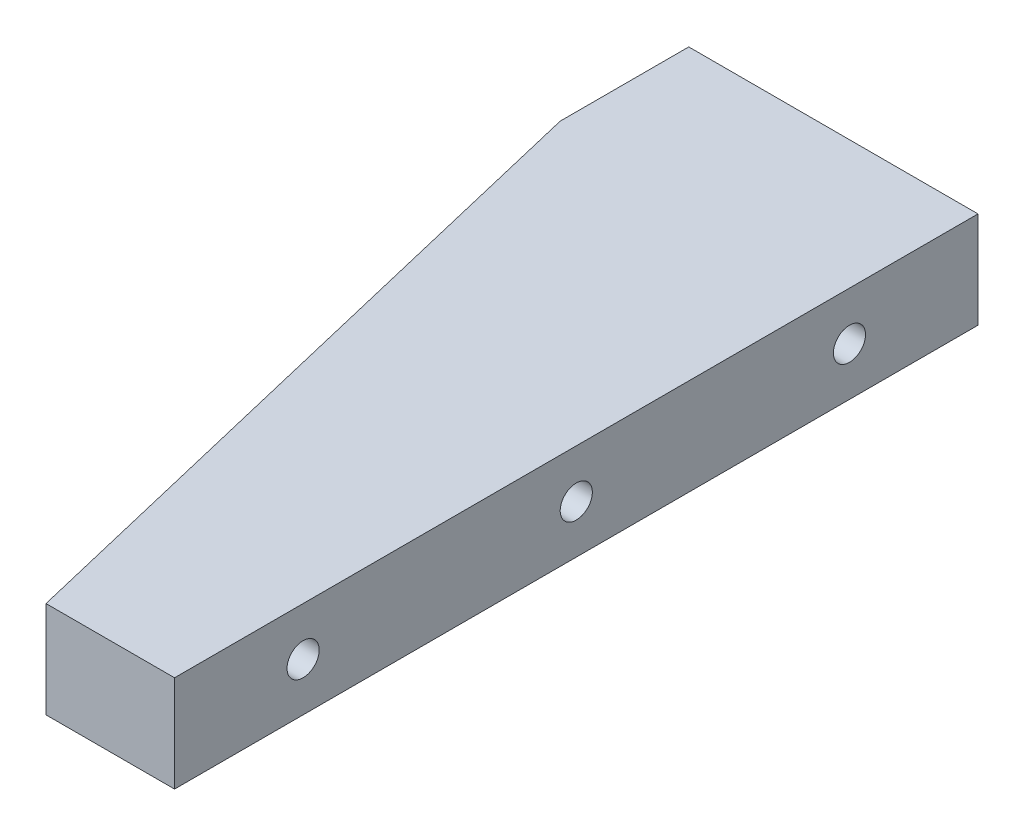
ISO-10303-21;
HEADER;
FILE_DESCRIPTION(('STEP AP214'),'2;1');
FILE_NAME('part.step','',(''),(''),'','','');
FILE_SCHEMA(('AUTOMOTIVE_DESIGN { 1 0 10303 214 1 1 1 1 }'));
ENDSEC;
DATA;
#1=APPLICATION_CONTEXT('core data for automotive mechanical design processes');
#2=APPLICATION_PROTOCOL_DEFINITION('international standard','automotive_design',2000,#1);
#3=PRODUCT_CONTEXT('',#1,'mechanical');
#4=PRODUCT('Part','Part','',(#3));
#5=PRODUCT_RELATED_PRODUCT_CATEGORY('part','',(#4));
#6=PRODUCT_DEFINITION_FORMATION('','',#4);
#7=PRODUCT_DEFINITION_CONTEXT('part definition',#1,'design');
#8=PRODUCT_DEFINITION('design','',#6,#7);
#9=PRODUCT_DEFINITION_SHAPE('','',#8);
#10=(LENGTH_UNIT() NAMED_UNIT(*) SI_UNIT(.MILLI.,.METRE.));
#11=(NAMED_UNIT(*) PLANE_ANGLE_UNIT() SI_UNIT($,.RADIAN.));
#12=(NAMED_UNIT(*) SI_UNIT($,.STERADIAN.) SOLID_ANGLE_UNIT());
#13=UNCERTAINTY_MEASURE_WITH_UNIT(LENGTH_MEASURE(1.E-05),#10,'distance_accuracy_value','');
#14=(GEOMETRIC_REPRESENTATION_CONTEXT(3) GLOBAL_UNCERTAINTY_ASSIGNED_CONTEXT((#13)) GLOBAL_UNIT_ASSIGNED_CONTEXT((#10,
#11,#12)) REPRESENTATION_CONTEXT('',''));
#15=CARTESIAN_POINT('',(0.,0.,0.));
#16=DIRECTION('',(0.,0.,1.));
#17=DIRECTION('',(1.,0.,0.));
#18=AXIS2_PLACEMENT_3D('',#15,#16,#17);
#19=CARTESIAN_POINT('',(-45.,15.,0.));
#20=DIRECTION('',(0.,0.,1.));
#21=DIRECTION('',(1.,0.,0.));
#22=AXIS2_PLACEMENT_3D('',#19,#20,#21);
#23=PLANE('',#22);
#24=CARTESIAN_POINT('',(-35.,7.5,0.));
#25=DIRECTION('',(0.,0.,-1.));
#26=DIRECTION('',(-1.,0.,0.));
#27=AXIS2_PLACEMENT_3D('',#24,#25,#26);
#28=CIRCLE('',#27,2.49999999999999);
#29=CARTESIAN_POINT('',(-37.5,7.5,0.));
#30=VERTEX_POINT('',#29);
#31=EDGE_CURVE('E151',#30,#30,#28,.T.);
#32=ORIENTED_EDGE('',*,*,#31,.F.);
#33=EDGE_LOOP('',(#32));
#34=FACE_BOUND('',#33,.T.);
#35=DIRECTION('',(-1.,0.,0.));
#36=VECTOR('',#35,1.);
#37=CARTESIAN_POINT('',(-45.,0.,0.));
#38=LINE('',#37,#36);
#39=CARTESIAN_POINT('',(0.,0.,0.));
#40=VERTEX_POINT('',#39);
#41=CARTESIAN_POINT('',(-45.,0.,0.));
#42=VERTEX_POINT('',#41);
#43=EDGE_CURVE('E113',#40,#42,#38,.T.);
#44=ORIENTED_EDGE('',*,*,#43,.T.);
#45=DIRECTION('',(0.,-1.,0.));
#46=VECTOR('',#45,1.);
#47=CARTESIAN_POINT('',(-45.,15.,0.));
#48=LINE('',#47,#46);
#49=CARTESIAN_POINT('',(-45.,15.,0.));
#50=VERTEX_POINT('',#49);
#51=EDGE_CURVE('E11',#50,#42,#48,.T.);
#52=ORIENTED_EDGE('',*,*,#51,.F.);
#53=DIRECTION('',(-1.,0.,0.));
#54=VECTOR('',#53,1.);
#55=CARTESIAN_POINT('',(-45.,15.,0.));
#56=LINE('',#55,#54);
#57=CARTESIAN_POINT('',(0.,15.,0.));
#58=VERTEX_POINT('',#57);
#59=EDGE_CURVE('E122',#58,#50,#56,.T.);
#60=ORIENTED_EDGE('',*,*,#59,.F.);
#61=DIRECTION('',(0.,-1.,0.));
#62=VECTOR('',#61,1.);
#63=CARTESIAN_POINT('',(0.,15.,0.));
#64=LINE('',#63,#62);
#65=EDGE_CURVE('E109',#58,#40,#64,.T.);
#66=ORIENTED_EDGE('',*,*,#65,.T.);
#67=EDGE_LOOP('',(#44,#52,#60,#66));
#68=FACE_BOUND('',#67,.T.);
#69=ADVANCED_FACE('F36',(#34,#68),#23,.F.);
#70=CARTESIAN_POINT('',(-45.,15.,20.));
#71=DIRECTION('',(1.,0.,0.));
#72=DIRECTION('',(0.,0.,-1.));
#73=AXIS2_PLACEMENT_3D('',#70,#71,#72);
#74=PLANE('',#73);
#75=DIRECTION('',(0.,0.,1.));
#76=VECTOR('',#75,1.);
#77=CARTESIAN_POINT('',(-45.,0.,20.));
#78=LINE('',#77,#76);
#79=CARTESIAN_POINT('',(-45.,0.,20.));
#80=VERTEX_POINT('',#79);
#81=EDGE_CURVE('E116',#42,#80,#78,.T.);
#82=ORIENTED_EDGE('',*,*,#81,.T.);
#83=DIRECTION('',(0.,-1.,0.));
#84=VECTOR('',#83,1.);
#85=CARTESIAN_POINT('',(-45.,15.,20.));
#86=LINE('',#85,#84);
#87=CARTESIAN_POINT('',(-45.,15.,20.));
#88=VERTEX_POINT('',#87);
#89=EDGE_CURVE('E44',#88,#80,#86,.T.);
#90=ORIENTED_EDGE('',*,*,#89,.F.);
#91=DIRECTION('',(0.,0.,1.));
#92=VECTOR('',#91,1.);
#93=CARTESIAN_POINT('',(-45.,15.,20.));
#94=LINE('',#93,#92);
#95=EDGE_CURVE('E87',#50,#88,#94,.T.);
#96=ORIENTED_EDGE('',*,*,#95,.F.);
#97=ORIENTED_EDGE('',*,*,#51,.T.);
#98=EDGE_LOOP('',(#82,#90,#96,#97));
#99=FACE_BOUND('',#98,.T.);
#100=ADVANCED_FACE('F144',(#99),#74,.F.);
#101=CARTESIAN_POINT('',(-20.,15.,125.));
#102=DIRECTION('',(0.972806214685367,0.,-0.23162052730604));
#103=DIRECTION('',(-0.23162052730604,0.,-0.972806214685367));
#104=AXIS2_PLACEMENT_3D('',#101,#102,#103);
#105=PLANE('',#104);
#106=DIRECTION('',(0.23162052730604,0.,0.972806214685367));
#107=VECTOR('',#106,1.);
#108=CARTESIAN_POINT('',(-20.,0.,125.));
#109=LINE('',#108,#107);
#110=CARTESIAN_POINT('',(-20.,0.,125.));
#111=VERTEX_POINT('',#110);
#112=EDGE_CURVE('E104',#80,#111,#109,.T.);
#113=ORIENTED_EDGE('',*,*,#112,.T.);
#114=DIRECTION('',(0.,-1.,0.));
#115=VECTOR('',#114,1.);
#116=CARTESIAN_POINT('',(-20.,15.,125.));
#117=LINE('',#116,#115);
#118=CARTESIAN_POINT('',(-20.,15.,125.));
#119=VERTEX_POINT('',#118);
#120=EDGE_CURVE('E101',#119,#111,#117,.T.);
#121=ORIENTED_EDGE('',*,*,#120,.F.);
#122=DIRECTION('',(0.23162052730604,0.,0.972806214685367));
#123=VECTOR('',#122,1.);
#124=CARTESIAN_POINT('',(-20.,15.,125.));
#125=LINE('',#124,#123);
#126=EDGE_CURVE('E93',#88,#119,#125,.T.);
#127=ORIENTED_EDGE('',*,*,#126,.F.);
#128=ORIENTED_EDGE('',*,*,#89,.T.);
#129=EDGE_LOOP('',(#113,#121,#127,#128));
#130=FACE_BOUND('',#129,.T.);
#131=ADVANCED_FACE('F102',(#130),#105,.F.);
#132=CARTESIAN_POINT('',(0.,15.,125.));
#133=DIRECTION('',(0.,0.,-1.));
#134=DIRECTION('',(-1.,0.,0.));
#135=AXIS2_PLACEMENT_3D('',#132,#133,#134);
#136=PLANE('',#135);
#137=DIRECTION('',(1.,0.,0.));
#138=VECTOR('',#137,1.);
#139=CARTESIAN_POINT('',(0.,0.,125.));
#140=LINE('',#139,#138);
#141=CARTESIAN_POINT('',(0.,0.,125.));
#142=VERTEX_POINT('',#141);
#143=EDGE_CURVE('E73',#111,#142,#140,.T.);
#144=ORIENTED_EDGE('',*,*,#143,.T.);
#145=DIRECTION('',(0.,-1.,0.));
#146=VECTOR('',#145,1.);
#147=CARTESIAN_POINT('',(0.,15.,125.));
#148=LINE('',#147,#146);
#149=CARTESIAN_POINT('',(0.,15.,125.));
#150=VERTEX_POINT('',#149);
#151=EDGE_CURVE('E105',#150,#142,#148,.T.);
#152=ORIENTED_EDGE('',*,*,#151,.F.);
#153=DIRECTION('',(1.,0.,0.));
#154=VECTOR('',#153,1.);
#155=CARTESIAN_POINT('',(0.,15.,125.));
#156=LINE('',#155,#154);
#157=EDGE_CURVE('E97',#119,#150,#156,.T.);
#158=ORIENTED_EDGE('',*,*,#157,.F.);
#159=ORIENTED_EDGE('',*,*,#120,.T.);
#160=EDGE_LOOP('',(#144,#152,#158,#159));
#161=FACE_BOUND('',#160,.T.);
#162=ADVANCED_FACE('F107',(#161),#136,.F.);
#163=CARTESIAN_POINT('',(0.,15.,0.));
#164=DIRECTION('',(-1.,0.,0.));
#165=DIRECTION('',(0.,0.,1.));
#166=AXIS2_PLACEMENT_3D('',#163,#164,#165);
#167=PLANE('',#166);
#168=CARTESIAN_POINT('',(0.,7.5,105.));
#169=DIRECTION('',(1.,0.,0.));
#170=DIRECTION('',(0.,0.,-1.));
#171=AXIS2_PLACEMENT_3D('',#168,#169,#170);
#172=CIRCLE('',#171,2.49999999999999);
#173=CARTESIAN_POINT('',(0.,7.5,102.5));
#174=VERTEX_POINT('',#173);
#175=EDGE_CURVE('E173',#174,#174,#172,.T.);
#176=ORIENTED_EDGE('',*,*,#175,.F.);
#177=EDGE_LOOP('',(#176));
#178=FACE_BOUND('',#177,.T.);
#179=CARTESIAN_POINT('',(0.,7.5,62.5));
#180=DIRECTION('',(1.,0.,0.));
#181=DIRECTION('',(0.,0.,-1.));
#182=AXIS2_PLACEMENT_3D('',#179,#180,#181);
#183=CIRCLE('',#182,2.49999999999999);
#184=CARTESIAN_POINT('',(0.,7.5,60.));
#185=VERTEX_POINT('',#184);
#186=EDGE_CURVE('E167',#185,#185,#183,.T.);
#187=ORIENTED_EDGE('',*,*,#186,.F.);
#188=EDGE_LOOP('',(#187));
#189=FACE_BOUND('',#188,.T.);
#190=CARTESIAN_POINT('',(0.,7.5,20.));
#191=DIRECTION('',(1.,0.,0.));
#192=DIRECTION('',(0.,0.,-1.));
#193=AXIS2_PLACEMENT_3D('',#190,#191,#192);
#194=CIRCLE('',#193,2.49999999999999);
#195=CARTESIAN_POINT('',(0.,7.5,17.5));
#196=VERTEX_POINT('',#195);
#197=EDGE_CURVE('E158',#196,#196,#194,.T.);
#198=ORIENTED_EDGE('',*,*,#197,.F.);
#199=EDGE_LOOP('',(#198));
#200=FACE_BOUND('',#199,.T.);
#201=DIRECTION('',(0.,0.,-1.));
#202=VECTOR('',#201,1.);
#203=CARTESIAN_POINT('',(0.,0.,0.));
#204=LINE('',#203,#202);
#205=EDGE_CURVE('E79',#142,#40,#204,.T.);
#206=ORIENTED_EDGE('',*,*,#205,.T.);
#207=ORIENTED_EDGE('',*,*,#65,.F.);
#208=DIRECTION('',(0.,0.,-1.));
#209=VECTOR('',#208,1.);
#210=CARTESIAN_POINT('',(0.,15.,0.));
#211=LINE('',#210,#209);
#212=EDGE_CURVE('E52',#150,#58,#211,.T.);
#213=ORIENTED_EDGE('',*,*,#212,.F.);
#214=ORIENTED_EDGE('',*,*,#151,.T.);
#215=EDGE_LOOP('',(#206,#207,#213,#214));
#216=FACE_BOUND('',#215,.T.);
#217=ADVANCED_FACE('F130',(#178,#189,#200,#216),#167,.F.);
#218=CARTESIAN_POINT('',(0.,15.,0.));
#219=DIRECTION('',(0.,-1.,0.));
#220=DIRECTION('',(0.,0.,-1.));
#221=AXIS2_PLACEMENT_3D('',#218,#219,#220);
#222=PLANE('',#221);
#223=ORIENTED_EDGE('',*,*,#59,.T.);
#224=ORIENTED_EDGE('',*,*,#95,.T.);
#225=ORIENTED_EDGE('',*,*,#126,.T.);
#226=ORIENTED_EDGE('',*,*,#157,.T.);
#227=ORIENTED_EDGE('',*,*,#212,.T.);
#228=EDGE_LOOP('',(#223,#224,#225,#226,#227));
#229=FACE_BOUND('',#228,.T.);
#230=ADVANCED_FACE('F95',(#229),#222,.F.);
#231=CARTESIAN_POINT('',(0.,0.,0.));
#232=DIRECTION('',(0.,-1.,0.));
#233=DIRECTION('',(0.,0.,-1.));
#234=AXIS2_PLACEMENT_3D('',#231,#232,#233);
#235=PLANE('',#234);
#236=ORIENTED_EDGE('',*,*,#43,.F.);
#237=ORIENTED_EDGE('',*,*,#205,.F.);
#238=ORIENTED_EDGE('',*,*,#143,.F.);
#239=ORIENTED_EDGE('',*,*,#112,.F.);
#240=ORIENTED_EDGE('',*,*,#81,.F.);
#241=EDGE_LOOP('',(#236,#237,#238,#239,#240));
#242=FACE_BOUND('',#241,.T.);
#243=ADVANCED_FACE('F126',(#242),#235,.T.);
#244=CARTESIAN_POINT('',(-35.,7.5,10.));
#245=DIRECTION('',(0.,0.,-1.));
#246=DIRECTION('',(-1.,0.,0.));
#247=AXIS2_PLACEMENT_3D('',#244,#245,#246);
#248=CONICAL_SURFACE('',#247,2.5,1.02974425867665);
#249=CARTESIAN_POINT('',(-35.,7.5,11.5021515475689));
#250=VERTEX_POINT('',#249);
#251=VERTEX_LOOP('',#250);
#252=FACE_BOUND('',#251,.T.);
#253=CARTESIAN_POINT('',(-35.,7.5,10.));
#254=DIRECTION('',(0.,0.,-1.));
#255=DIRECTION('',(-1.,0.,0.));
#256=AXIS2_PLACEMENT_3D('',#253,#254,#255);
#257=CIRCLE('',#256,2.5);
#258=CARTESIAN_POINT('',(-37.5,7.5,10.));
#259=VERTEX_POINT('',#258);
#260=EDGE_CURVE('E117',#259,#259,#257,.T.);
#261=ORIENTED_EDGE('',*,*,#260,.T.);
#262=EDGE_LOOP('',(#261));
#263=FACE_BOUND('',#262,.T.);
#264=ADVANCED_FACE('F207',(#252,#263),#248,.F.);
#265=CARTESIAN_POINT('',(-35.,7.5,0.));
#266=DIRECTION('',(0.,0.,-1.));
#267=DIRECTION('',(-1.,0.,0.));
#268=AXIS2_PLACEMENT_3D('',#265,#266,#267);
#269=CYLINDRICAL_SURFACE('',#268,2.49999999999999);
#270=ORIENTED_EDGE('',*,*,#260,.F.);
#271=EDGE_LOOP('',(#270));
#272=FACE_BOUND('',#271,.T.);
#273=ORIENTED_EDGE('',*,*,#31,.T.);
#274=EDGE_LOOP('',(#273));
#275=FACE_BOUND('',#274,.T.);
#276=ADVANCED_FACE('F203',(#272,#275),#269,.F.);
#277=CARTESIAN_POINT('',(-10.,7.5,20.));
#278=DIRECTION('',(1.,0.,0.));
#279=DIRECTION('',(0.,0.,-1.));
#280=AXIS2_PLACEMENT_3D('',#277,#278,#279);
#281=CONICAL_SURFACE('',#280,2.5,1.02974425867665);
#282=CARTESIAN_POINT('',(-11.5021515475689,7.5,20.));
#283=VERTEX_POINT('',#282);
#284=VERTEX_LOOP('',#283);
#285=FACE_BOUND('',#284,.T.);
#286=CARTESIAN_POINT('',(-10.,7.5,20.));
#287=DIRECTION('',(1.,0.,0.));
#288=DIRECTION('',(0.,0.,-1.));
#289=AXIS2_PLACEMENT_3D('',#286,#287,#288);
#290=CIRCLE('',#289,2.5);
#291=CARTESIAN_POINT('',(-10.,7.5,17.5));
#292=VERTEX_POINT('',#291);
#293=EDGE_CURVE('E153',#292,#292,#290,.T.);
#294=ORIENTED_EDGE('',*,*,#293,.T.);
#295=EDGE_LOOP('',(#294));
#296=FACE_BOUND('',#295,.T.);
#297=ADVANCED_FACE('F199',(#285,#296),#281,.F.);
#298=CARTESIAN_POINT('',(0.,7.5,20.));
#299=DIRECTION('',(1.,0.,0.));
#300=DIRECTION('',(0.,0.,-1.));
#301=AXIS2_PLACEMENT_3D('',#298,#299,#300);
#302=CYLINDRICAL_SURFACE('',#301,2.49999999999999);
#303=ORIENTED_EDGE('',*,*,#293,.F.);
#304=EDGE_LOOP('',(#303));
#305=FACE_BOUND('',#304,.T.);
#306=ORIENTED_EDGE('',*,*,#197,.T.);
#307=EDGE_LOOP('',(#306));
#308=FACE_BOUND('',#307,.T.);
#309=ADVANCED_FACE('F195',(#305,#308),#302,.F.);
#310=CARTESIAN_POINT('',(-9.99999999999999,7.5,62.5));
#311=DIRECTION('',(1.,0.,0.));
#312=DIRECTION('',(0.,0.,-1.));
#313=AXIS2_PLACEMENT_3D('',#310,#311,#312);
#314=CONICAL_SURFACE('',#313,2.5,1.02974425867665);
#315=CARTESIAN_POINT('',(-11.5021515475689,7.5,62.5));
#316=VERTEX_POINT('',#315);
#317=VERTEX_LOOP('',#316);
#318=FACE_BOUND('',#317,.T.);
#319=CARTESIAN_POINT('',(-9.99999999999999,7.5,62.5));
#320=DIRECTION('',(1.,0.,0.));
#321=DIRECTION('',(0.,0.,-1.));
#322=AXIS2_PLACEMENT_3D('',#319,#320,#321);
#323=CIRCLE('',#322,2.5);
#324=CARTESIAN_POINT('',(-9.99999999999999,7.5,60.));
#325=VERTEX_POINT('',#324);
#326=EDGE_CURVE('E164',#325,#325,#323,.T.);
#327=ORIENTED_EDGE('',*,*,#326,.T.);
#328=EDGE_LOOP('',(#327));
#329=FACE_BOUND('',#328,.T.);
#330=ADVANCED_FACE('F191',(#318,#329),#314,.F.);
#331=CARTESIAN_POINT('',(0.,7.5,62.5));
#332=DIRECTION('',(1.,0.,0.));
#333=DIRECTION('',(0.,0.,-1.));
#334=AXIS2_PLACEMENT_3D('',#331,#332,#333);
#335=CYLINDRICAL_SURFACE('',#334,2.49999999999999);
#336=ORIENTED_EDGE('',*,*,#326,.F.);
#337=EDGE_LOOP('',(#336));
#338=FACE_BOUND('',#337,.T.);
#339=ORIENTED_EDGE('',*,*,#186,.T.);
#340=EDGE_LOOP('',(#339));
#341=FACE_BOUND('',#340,.T.);
#342=ADVANCED_FACE('F184',(#338,#341),#335,.F.);
#343=CARTESIAN_POINT('',(-9.99999999999999,7.5,105.));
#344=DIRECTION('',(1.,0.,0.));
#345=DIRECTION('',(0.,0.,-1.));
#346=AXIS2_PLACEMENT_3D('',#343,#344,#345);
#347=CONICAL_SURFACE('',#346,2.5,1.02974425867665);
#348=CARTESIAN_POINT('',(-11.5021515475689,7.5,105.));
#349=VERTEX_POINT('',#348);
#350=VERTEX_LOOP('',#349);
#351=FACE_BOUND('',#350,.T.);
#352=CARTESIAN_POINT('',(-9.99999999999999,7.5,105.));
#353=DIRECTION('',(1.,0.,0.));
#354=DIRECTION('',(0.,0.,-1.));
#355=AXIS2_PLACEMENT_3D('',#352,#353,#354);
#356=CIRCLE('',#355,2.5);
#357=CARTESIAN_POINT('',(-9.99999999999999,7.5,102.5));
#358=VERTEX_POINT('',#357);
#359=EDGE_CURVE('E170',#358,#358,#356,.T.);
#360=ORIENTED_EDGE('',*,*,#359,.T.);
#361=EDGE_LOOP('',(#360));
#362=FACE_BOUND('',#361,.T.);
#363=ADVANCED_FACE('F178',(#351,#362),#347,.F.);
#364=CARTESIAN_POINT('',(0.,7.5,105.));
#365=DIRECTION('',(1.,0.,0.));
#366=DIRECTION('',(0.,0.,-1.));
#367=AXIS2_PLACEMENT_3D('',#364,#365,#366);
#368=CYLINDRICAL_SURFACE('',#367,2.49999999999999);
#369=ORIENTED_EDGE('',*,*,#359,.F.);
#370=EDGE_LOOP('',(#369));
#371=FACE_BOUND('',#370,.T.);
#372=ORIENTED_EDGE('',*,*,#175,.T.);
#373=EDGE_LOOP('',(#372));
#374=FACE_BOUND('',#373,.T.);
#375=ADVANCED_FACE('F176',(#371,#374),#368,.F.);
#376=CLOSED_SHELL('',(#69,#100,#131,#162,#217,#230,#243,#264,#276,#297,#309,#330,#342,#363,#375));
#377=MANIFOLD_SOLID_BREP('B2',#376);
#378=ADVANCED_BREP_SHAPE_REPRESENTATION('',(#18,#377),#14);
#379=SHAPE_DEFINITION_REPRESENTATION(#9,#378);
ENDSEC;
END-ISO-10303-21;
